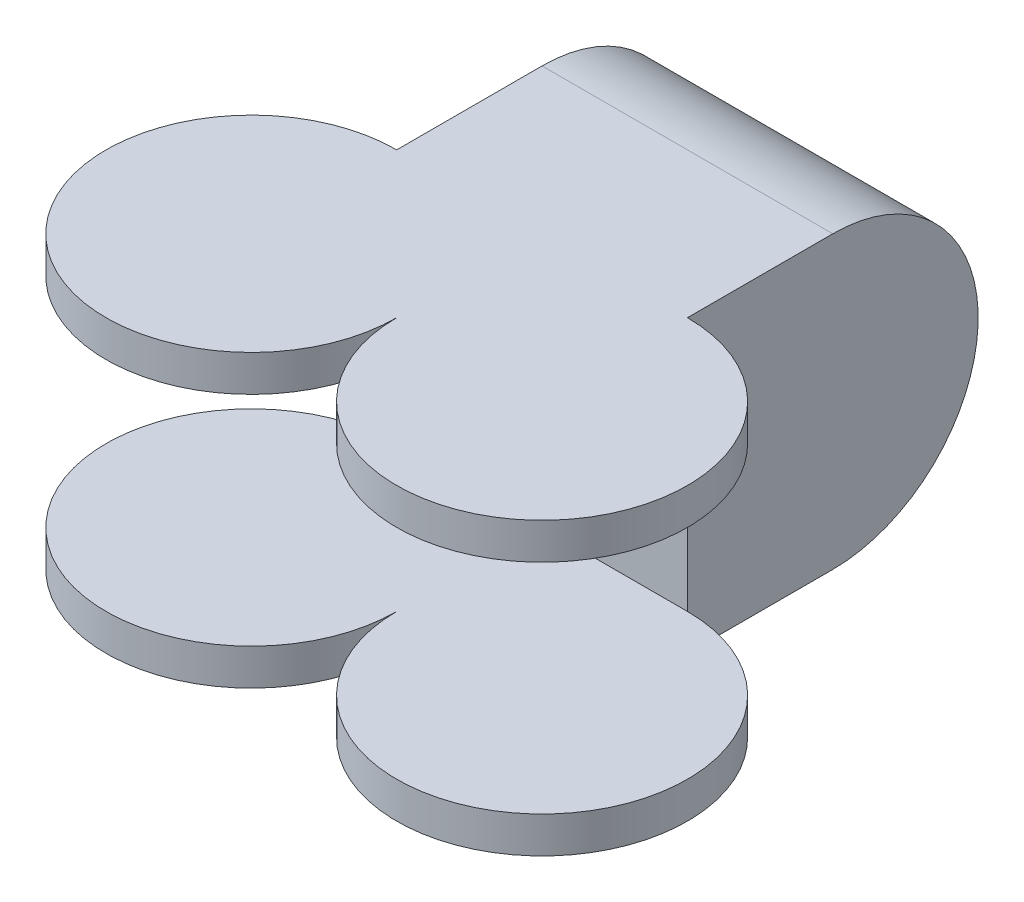
ISO-10303-21;
HEADER;
FILE_DESCRIPTION(('STEP AP214'),'2;1');
FILE_NAME('part.step','',(''),(''),'','','');
FILE_SCHEMA(('AUTOMOTIVE_DESIGN { 1 0 10303 214 1 1 1 1 }'));
ENDSEC;
DATA;
#1=APPLICATION_CONTEXT('core data for automotive mechanical design processes');
#2=APPLICATION_PROTOCOL_DEFINITION('international standard','automotive_design',2000,#1);
#3=PRODUCT_CONTEXT('',#1,'mechanical');
#4=PRODUCT('Part','Part','',(#3));
#5=PRODUCT_RELATED_PRODUCT_CATEGORY('part','',(#4));
#6=PRODUCT_DEFINITION_FORMATION('','',#4);
#7=PRODUCT_DEFINITION_CONTEXT('part definition',#1,'design');
#8=PRODUCT_DEFINITION('design','',#6,#7);
#9=PRODUCT_DEFINITION_SHAPE('','',#8);
#10=(LENGTH_UNIT() NAMED_UNIT(*) SI_UNIT(.MILLI.,.METRE.));
#11=(NAMED_UNIT(*) PLANE_ANGLE_UNIT() SI_UNIT($,.RADIAN.));
#12=(NAMED_UNIT(*) SI_UNIT($,.STERADIAN.) SOLID_ANGLE_UNIT());
#13=UNCERTAINTY_MEASURE_WITH_UNIT(LENGTH_MEASURE(1.E-05),#10,'distance_accuracy_value','');
#14=(GEOMETRIC_REPRESENTATION_CONTEXT(3) GLOBAL_UNCERTAINTY_ASSIGNED_CONTEXT((#13)) GLOBAL_UNIT_ASSIGNED_CONTEXT((#10,
#11,#12)) REPRESENTATION_CONTEXT('',''));
#15=CARTESIAN_POINT('',(0.,0.,0.));
#16=DIRECTION('',(0.,0.,1.));
#17=DIRECTION('',(1.,0.,0.));
#18=AXIS2_PLACEMENT_3D('',#15,#16,#17);
#19=CARTESIAN_POINT('',(0.,-40.,80.));
#20=DIRECTION('',(0.,1.,0.));
#21=DIRECTION('',(0.,0.,1.));
#22=AXIS2_PLACEMENT_3D('',#19,#20,#21);
#23=CYLINDRICAL_SURFACE('',#22,40.);
#24=CARTESIAN_POINT('',(0.,30.,80.));
#25=DIRECTION('',(0.,1.,0.));
#26=DIRECTION('',(0.,0.,1.));
#27=AXIS2_PLACEMENT_3D('',#24,#25,#26);
#28=CIRCLE('',#27,40.);
#29=CARTESIAN_POINT('',(40.,30.,80.));
#30=VERTEX_POINT('',#29);
#31=CARTESIAN_POINT('',(0.,30.,40.));
#32=VERTEX_POINT('',#31);
#33=EDGE_CURVE('E146',#30,#32,#28,.F.);
#34=ORIENTED_EDGE('',*,*,#33,.F.);
#35=DIRECTION('',(0.,1.,0.));
#36=VECTOR('',#35,1.);
#37=CARTESIAN_POINT('',(40.,-40.,80.));
#38=LINE('',#37,#36);
#39=CARTESIAN_POINT('',(40.,40.,80.));
#40=VERTEX_POINT('',#39);
#41=EDGE_CURVE('E160',#30,#40,#38,.T.);
#42=ORIENTED_EDGE('',*,*,#41,.T.);
#43=CARTESIAN_POINT('',(0.,40.,80.));
#44=DIRECTION('',(0.,1.,0.));
#45=DIRECTION('',(0.,0.,1.));
#46=AXIS2_PLACEMENT_3D('',#43,#44,#45);
#47=CIRCLE('',#46,40.);
#48=CARTESIAN_POINT('',(0.,40.,40.));
#49=VERTEX_POINT('',#48);
#50=EDGE_CURVE('E190',#49,#40,#47,.T.);
#51=ORIENTED_EDGE('',*,*,#50,.F.);
#52=DIRECTION('',(0.,1.,0.));
#53=VECTOR('',#52,1.);
#54=CARTESIAN_POINT('',(0.,-40.,40.));
#55=LINE('',#54,#53);
#56=EDGE_CURVE('E107',#32,#49,#55,.T.);
#57=ORIENTED_EDGE('',*,*,#56,.F.);
#58=EDGE_LOOP('',(#34,#42,#51,#57));
#59=FACE_BOUND('',#58,.T.);
#60=ADVANCED_FACE('F57',(#59),#23,.T.);
#61=CARTESIAN_POINT('',(80.,-40.,80.));
#62=DIRECTION('',(0.,1.,0.));
#63=DIRECTION('',(0.,0.,1.));
#64=AXIS2_PLACEMENT_3D('',#61,#62,#63);
#65=CYLINDRICAL_SURFACE('',#64,40.);
#66=ORIENTED_EDGE('',*,*,#41,.F.);
#67=CARTESIAN_POINT('',(80.,30.,80.));
#68=DIRECTION('',(0.,1.,0.));
#69=DIRECTION('',(0.,0.,1.));
#70=AXIS2_PLACEMENT_3D('',#67,#68,#69);
#71=CIRCLE('',#70,40.);
#72=CARTESIAN_POINT('',(80.,30.,40.));
#73=VERTEX_POINT('',#72);
#74=EDGE_CURVE('E12',#73,#30,#71,.F.);
#75=ORIENTED_EDGE('',*,*,#74,.F.);
#76=DIRECTION('',(0.,1.,0.));
#77=VECTOR('',#76,1.);
#78=CARTESIAN_POINT('',(80.,-40.,40.));
#79=LINE('',#78,#77);
#80=CARTESIAN_POINT('',(80.,40.,40.));
#81=VERTEX_POINT('',#80);
#82=EDGE_CURVE('E195',#73,#81,#79,.T.);
#83=ORIENTED_EDGE('',*,*,#82,.T.);
#84=CARTESIAN_POINT('',(80.,40.,80.));
#85=DIRECTION('',(0.,1.,0.));
#86=DIRECTION('',(0.,0.,1.));
#87=AXIS2_PLACEMENT_3D('',#84,#85,#86);
#88=CIRCLE('',#87,40.);
#89=EDGE_CURVE('E192',#40,#81,#88,.T.);
#90=ORIENTED_EDGE('',*,*,#89,.F.);
#91=EDGE_LOOP('',(#66,#75,#83,#90));
#92=FACE_BOUND('',#91,.T.);
#93=ADVANCED_FACE('F207',(#92),#65,.T.);
#94=CARTESIAN_POINT('',(80.,0.,0.));
#95=DIRECTION('',(-1.,0.,0.));
#96=DIRECTION('',(0.,0.,1.));
#97=AXIS2_PLACEMENT_3D('',#94,#95,#96);
#98=CYLINDRICAL_SURFACE('',#97,40.);
#99=CARTESIAN_POINT('',(0.,0.,0.));
#100=DIRECTION('',(1.,0.,0.));
#101=DIRECTION('',(0.,0.,-1.));
#102=AXIS2_PLACEMENT_3D('',#99,#100,#101);
#103=CIRCLE('',#102,40.);
#104=CARTESIAN_POINT('',(0.,-40.,0.));
#105=VERTEX_POINT('',#104);
#106=CARTESIAN_POINT('',(0.,40.,0.));
#107=VERTEX_POINT('',#106);
#108=EDGE_CURVE('E173',#105,#107,#103,.T.);
#109=ORIENTED_EDGE('',*,*,#108,.T.);
#110=DIRECTION('',(-1.,0.,0.));
#111=VECTOR('',#110,1.);
#112=CARTESIAN_POINT('',(80.,40.,0.));
#113=LINE('',#112,#111);
#114=CARTESIAN_POINT('',(80.,40.,0.));
#115=VERTEX_POINT('',#114);
#116=EDGE_CURVE('E180',#115,#107,#113,.T.);
#117=ORIENTED_EDGE('',*,*,#116,.F.);
#118=CARTESIAN_POINT('',(80.,0.,0.));
#119=DIRECTION('',(1.,0.,0.));
#120=DIRECTION('',(0.,0.,-1.));
#121=AXIS2_PLACEMENT_3D('',#118,#119,#120);
#122=CIRCLE('',#121,40.);
#123=CARTESIAN_POINT('',(80.,-40.,0.));
#124=VERTEX_POINT('',#123);
#125=EDGE_CURVE('E166',#124,#115,#122,.T.);
#126=ORIENTED_EDGE('',*,*,#125,.F.);
#127=DIRECTION('',(-1.,0.,0.));
#128=VECTOR('',#127,1.);
#129=CARTESIAN_POINT('',(80.,-40.,0.));
#130=LINE('',#129,#128);
#131=EDGE_CURVE('E172',#124,#105,#130,.T.);
#132=ORIENTED_EDGE('',*,*,#131,.T.);
#133=EDGE_LOOP('',(#109,#117,#126,#132));
#134=FACE_BOUND('',#133,.T.);
#135=ADVANCED_FACE('F59',(#134),#98,.T.);
#136=CARTESIAN_POINT('',(80.,40.,0.));
#137=DIRECTION('',(0.,-1.,0.));
#138=DIRECTION('',(0.,0.,-1.));
#139=AXIS2_PLACEMENT_3D('',#136,#137,#138);
#140=PLANE('',#139);
#141=ORIENTED_EDGE('',*,*,#50,.T.);
#142=ORIENTED_EDGE('',*,*,#89,.T.);
#143=DIRECTION('',(0.,0.,1.));
#144=VECTOR('',#143,1.);
#145=CARTESIAN_POINT('',(80.,40.,0.));
#146=LINE('',#145,#144);
#147=EDGE_CURVE('E168',#115,#81,#146,.T.);
#148=ORIENTED_EDGE('',*,*,#147,.F.);
#149=ORIENTED_EDGE('',*,*,#116,.T.);
#150=DIRECTION('',(0.,0.,1.));
#151=VECTOR('',#150,1.);
#152=CARTESIAN_POINT('',(0.,40.,0.));
#153=LINE('',#152,#151);
#154=EDGE_CURVE('E86',#107,#49,#153,.T.);
#155=ORIENTED_EDGE('',*,*,#154,.T.);
#156=EDGE_LOOP('',(#141,#142,#148,#149,#155));
#157=FACE_BOUND('',#156,.T.);
#158=ADVANCED_FACE('F184',(#157),#140,.F.);
#159=CARTESIAN_POINT('',(80.,-40.,0.));
#160=DIRECTION('',(0.,1.,0.));
#161=DIRECTION('',(0.,0.,1.));
#162=AXIS2_PLACEMENT_3D('',#159,#160,#161);
#163=PLANE('',#162);
#164=CARTESIAN_POINT('',(80.,-40.,80.));
#165=DIRECTION('',(0.,1.,0.));
#166=DIRECTION('',(0.,0.,1.));
#167=AXIS2_PLACEMENT_3D('',#164,#165,#166);
#168=CIRCLE('',#167,40.);
#169=CARTESIAN_POINT('',(40.,-40.,80.));
#170=VERTEX_POINT('',#169);
#171=CARTESIAN_POINT('',(80.,-40.,40.));
#172=VERTEX_POINT('',#171);
#173=EDGE_CURVE('E115',#170,#172,#168,.T.);
#174=ORIENTED_EDGE('',*,*,#173,.F.);
#175=CARTESIAN_POINT('',(0.,-40.,80.));
#176=DIRECTION('',(0.,1.,0.));
#177=DIRECTION('',(0.,0.,1.));
#178=AXIS2_PLACEMENT_3D('',#175,#176,#177);
#179=CIRCLE('',#178,40.);
#180=CARTESIAN_POINT('',(0.,-40.,40.));
#181=VERTEX_POINT('',#180);
#182=EDGE_CURVE('E163',#181,#170,#179,.T.);
#183=ORIENTED_EDGE('',*,*,#182,.F.);
#184=DIRECTION('',(0.,0.,-1.));
#185=VECTOR('',#184,1.);
#186=CARTESIAN_POINT('',(0.,-40.,0.));
#187=LINE('',#186,#185);
#188=EDGE_CURVE('E159',#181,#105,#187,.T.);
#189=ORIENTED_EDGE('',*,*,#188,.T.);
#190=ORIENTED_EDGE('',*,*,#131,.F.);
#191=DIRECTION('',(0.,0.,-1.));
#192=VECTOR('',#191,1.);
#193=CARTESIAN_POINT('',(80.,-40.,0.));
#194=LINE('',#193,#192);
#195=EDGE_CURVE('E74',#172,#124,#194,.T.);
#196=ORIENTED_EDGE('',*,*,#195,.F.);
#197=EDGE_LOOP('',(#174,#183,#189,#190,#196));
#198=FACE_BOUND('',#197,.T.);
#199=ADVANCED_FACE('F189',(#198),#163,.F.);
#200=CARTESIAN_POINT('',(80.,0.,0.));
#201=DIRECTION('',(1.,0.,0.));
#202=DIRECTION('',(0.,0.,-1.));
#203=AXIS2_PLACEMENT_3D('',#200,#201,#202);
#204=PLANE('',#203);
#205=CARTESIAN_POINT('',(80.,-30.,40.));
#206=VERTEX_POINT('',#205);
#207=EDGE_CURVE('E197',#172,#206,#79,.T.);
#208=ORIENTED_EDGE('',*,*,#207,.F.);
#209=ORIENTED_EDGE('',*,*,#195,.T.);
#210=ORIENTED_EDGE('',*,*,#125,.T.);
#211=ORIENTED_EDGE('',*,*,#147,.T.);
#212=ORIENTED_EDGE('',*,*,#82,.F.);
#213=EDGE_CURVE('E199',#206,#73,#79,.T.);
#214=ORIENTED_EDGE('',*,*,#213,.F.);
#215=EDGE_LOOP('',(#208,#209,#210,#211,#212,#214));
#216=FACE_BOUND('',#215,.T.);
#217=ADVANCED_FACE('F209',(#216),#204,.T.);
#218=CARTESIAN_POINT('',(0.,0.,0.));
#219=DIRECTION('',(1.,0.,0.));
#220=DIRECTION('',(0.,0.,-1.));
#221=AXIS2_PLACEMENT_3D('',#218,#219,#220);
#222=PLANE('',#221);
#223=ORIENTED_EDGE('',*,*,#188,.F.);
#224=CARTESIAN_POINT('',(0.,-30.,40.));
#225=VERTEX_POINT('',#224);
#226=EDGE_CURVE('E96',#181,#225,#55,.T.);
#227=ORIENTED_EDGE('',*,*,#226,.T.);
#228=DIRECTION('',(0.,1.,0.));
#229=VECTOR('',#228,1.);
#230=CARTESIAN_POINT('',(0.,-40.,40.));
#231=LINE('',#230,#229);
#232=EDGE_CURVE('E139',#32,#225,#231,.F.);
#233=ORIENTED_EDGE('',*,*,#232,.F.);
#234=ORIENTED_EDGE('',*,*,#56,.T.);
#235=ORIENTED_EDGE('',*,*,#154,.F.);
#236=ORIENTED_EDGE('',*,*,#108,.F.);
#237=EDGE_LOOP('',(#223,#227,#233,#234,#235,#236));
#238=FACE_BOUND('',#237,.T.);
#239=ADVANCED_FACE('F158',(#238),#222,.F.);
#240=CARTESIAN_POINT('',(0.,-30.,80.));
#241=DIRECTION('',(0.,-1.,0.));
#242=DIRECTION('',(0.,0.,-1.));
#243=AXIS2_PLACEMENT_3D('',#240,#241,#242);
#244=CIRCLE('',#243,40.);
#245=CARTESIAN_POINT('',(40.,-30.,80.));
#246=VERTEX_POINT('',#245);
#247=EDGE_CURVE('E147',#225,#246,#244,.F.);
#248=ORIENTED_EDGE('',*,*,#247,.F.);
#249=ORIENTED_EDGE('',*,*,#226,.F.);
#250=ORIENTED_EDGE('',*,*,#182,.T.);
#251=EDGE_CURVE('E155',#170,#246,#38,.T.);
#252=ORIENTED_EDGE('',*,*,#251,.T.);
#253=EDGE_LOOP('',(#248,#249,#250,#252));
#254=FACE_BOUND('',#253,.T.);
#255=ADVANCED_FACE('F154',(#254),#23,.T.);
#256=CARTESIAN_POINT('',(80.,-30.,80.));
#257=DIRECTION('',(0.,-1.,0.));
#258=DIRECTION('',(0.,0.,-1.));
#259=AXIS2_PLACEMENT_3D('',#256,#257,#258);
#260=CIRCLE('',#259,40.);
#261=EDGE_CURVE('E66',#246,#206,#260,.F.);
#262=ORIENTED_EDGE('',*,*,#261,.F.);
#263=ORIENTED_EDGE('',*,*,#251,.F.);
#264=ORIENTED_EDGE('',*,*,#173,.T.);
#265=ORIENTED_EDGE('',*,*,#207,.T.);
#266=EDGE_LOOP('',(#262,#263,#264,#265));
#267=FACE_BOUND('',#266,.T.);
#268=ADVANCED_FACE('F210',(#267),#65,.T.);
#269=CARTESIAN_POINT('',(-53.,30.,40.));
#270=DIRECTION('',(0.,0.,-1.));
#271=DIRECTION('',(-1.,0.,0.));
#272=AXIS2_PLACEMENT_3D('',#269,#270,#271);
#273=PLANE('',#272);
#274=ORIENTED_EDGE('',*,*,#232,.T.);
#275=DIRECTION('',(1.,0.,0.));
#276=VECTOR('',#275,1.);
#277=CARTESIAN_POINT('',(-53.,-30.,40.));
#278=LINE('',#277,#276);
#279=EDGE_CURVE('E142',#225,#206,#278,.T.);
#280=ORIENTED_EDGE('',*,*,#279,.T.);
#281=ORIENTED_EDGE('',*,*,#213,.T.);
#282=DIRECTION('',(1.,0.,0.));
#283=VECTOR('',#282,1.);
#284=CARTESIAN_POINT('',(-53.,30.,40.));
#285=LINE('',#284,#283);
#286=EDGE_CURVE('E145',#32,#73,#285,.T.);
#287=ORIENTED_EDGE('',*,*,#286,.F.);
#288=EDGE_LOOP('',(#274,#280,#281,#287));
#289=FACE_BOUND('',#288,.T.);
#290=ADVANCED_FACE('F141',(#289),#273,.F.);
#291=CARTESIAN_POINT('',(-53.,30.,120.));
#292=DIRECTION('',(0.,1.,0.));
#293=DIRECTION('',(0.,0.,1.));
#294=AXIS2_PLACEMENT_3D('',#291,#292,#293);
#295=PLANE('',#294);
#296=ORIENTED_EDGE('',*,*,#33,.T.);
#297=ORIENTED_EDGE('',*,*,#286,.T.);
#298=ORIENTED_EDGE('',*,*,#74,.T.);
#299=EDGE_LOOP('',(#296,#297,#298));
#300=FACE_BOUND('',#299,.T.);
#301=ADVANCED_FACE('F203',(#300),#295,.F.);
#302=CARTESIAN_POINT('',(-53.,-30.,120.));
#303=DIRECTION('',(0.,-1.,0.));
#304=DIRECTION('',(0.,0.,-1.));
#305=AXIS2_PLACEMENT_3D('',#302,#303,#304);
#306=PLANE('',#305);
#307=ORIENTED_EDGE('',*,*,#247,.T.);
#308=ORIENTED_EDGE('',*,*,#261,.T.);
#309=ORIENTED_EDGE('',*,*,#279,.F.);
#310=EDGE_LOOP('',(#307,#308,#309));
#311=FACE_BOUND('',#310,.T.);
#312=ADVANCED_FACE('F150',(#311),#306,.F.);
#313=CLOSED_SHELL('',(#60,#93,#135,#158,#199,#217,#239,#255,#268,#290,#301,#312));
#314=MANIFOLD_SOLID_BREP('B2',#313);
#315=ADVANCED_BREP_SHAPE_REPRESENTATION('',(#18,#314),#14);
#316=SHAPE_DEFINITION_REPRESENTATION(#9,#315);
ENDSEC;
END-ISO-10303-21;
